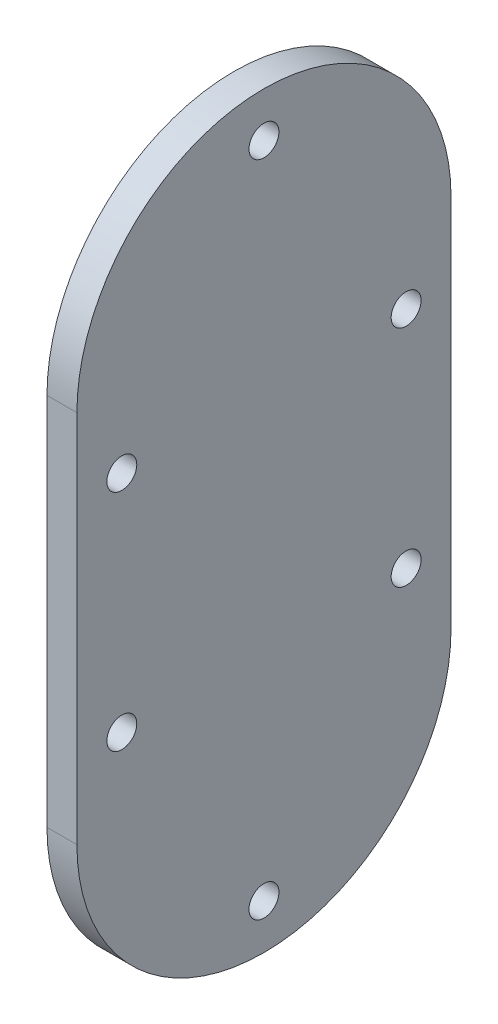
ISO-10303-21;
HEADER;
FILE_DESCRIPTION(('STEP AP214'),'2;1');
FILE_NAME('part.step','',(''),(''),'','','');
FILE_SCHEMA(('AUTOMOTIVE_DESIGN { 1 0 10303 214 1 1 1 1 }'));
ENDSEC;
DATA;
#1=APPLICATION_CONTEXT('core data for automotive mechanical design processes');
#2=APPLICATION_PROTOCOL_DEFINITION('international standard','automotive_design',2000,#1);
#3=PRODUCT_CONTEXT('',#1,'mechanical');
#4=PRODUCT('Part','Part','',(#3));
#5=PRODUCT_RELATED_PRODUCT_CATEGORY('part','',(#4));
#6=PRODUCT_DEFINITION_FORMATION('','',#4);
#7=PRODUCT_DEFINITION_CONTEXT('part definition',#1,'design');
#8=PRODUCT_DEFINITION('design','',#6,#7);
#9=PRODUCT_DEFINITION_SHAPE('','',#8);
#10=(LENGTH_UNIT() NAMED_UNIT(*) SI_UNIT(.MILLI.,.METRE.));
#11=(NAMED_UNIT(*) PLANE_ANGLE_UNIT() SI_UNIT($,.RADIAN.));
#12=(NAMED_UNIT(*) SI_UNIT($,.STERADIAN.) SOLID_ANGLE_UNIT());
#13=UNCERTAINTY_MEASURE_WITH_UNIT(LENGTH_MEASURE(1.E-05),#10,'distance_accuracy_value','');
#14=(GEOMETRIC_REPRESENTATION_CONTEXT(3) GLOBAL_UNCERTAINTY_ASSIGNED_CONTEXT((#13)) GLOBAL_UNIT_ASSIGNED_CONTEXT((#10,
#11,#12)) REPRESENTATION_CONTEXT('',''));
#15=CARTESIAN_POINT('',(0.,0.,0.));
#16=DIRECTION('',(0.,0.,1.));
#17=DIRECTION('',(1.,0.,0.));
#18=AXIS2_PLACEMENT_3D('',#15,#16,#17);
#19=CARTESIAN_POINT('',(4.,0.,0.));
#20=DIRECTION('',(1.,0.,0.));
#21=DIRECTION('',(0.,0.,-1.));
#22=AXIS2_PLACEMENT_3D('',#19,#20,#21);
#23=PLANE('',#22);
#24=CARTESIAN_POINT('',(4.,10.,-19.));
#25=DIRECTION('',(1.,0.,0.));
#26=DIRECTION('',(0.,0.,-1.));
#27=AXIS2_PLACEMENT_3D('',#24,#25,#26);
#28=CIRCLE('',#27,2.);
#29=CARTESIAN_POINT('',(4.,10.,-21.));
#30=VERTEX_POINT('',#29);
#31=EDGE_CURVE('E141',#30,#30,#28,.T.);
#32=ORIENTED_EDGE('',*,*,#31,.F.);
#33=EDGE_LOOP('',(#32));
#34=FACE_BOUND('',#33,.T.);
#35=CARTESIAN_POINT('',(4.,69.,0.));
#36=DIRECTION('',(1.,0.,0.));
#37=DIRECTION('',(0.,0.,-1.));
#38=AXIS2_PLACEMENT_3D('',#35,#36,#37);
#39=CIRCLE('',#38,2.);
#40=CARTESIAN_POINT('',(4.,69.,-2.));
#41=VERTEX_POINT('',#40);
#42=EDGE_CURVE('E129',#41,#41,#39,.T.);
#43=ORIENTED_EDGE('',*,*,#42,.F.);
#44=EDGE_LOOP('',(#43));
#45=FACE_BOUND('',#44,.T.);
#46=CARTESIAN_POINT('',(4.,10.,19.));
#47=DIRECTION('',(1.,0.,0.));
#48=DIRECTION('',(0.,0.,-1.));
#49=AXIS2_PLACEMENT_3D('',#46,#47,#48);
#50=CIRCLE('',#49,2.);
#51=CARTESIAN_POINT('',(4.,10.,17.));
#52=VERTEX_POINT('',#51);
#53=EDGE_CURVE('E108',#52,#52,#50,.T.);
#54=ORIENTED_EDGE('',*,*,#53,.F.);
#55=EDGE_LOOP('',(#54));
#56=FACE_BOUND('',#55,.T.);
#57=CARTESIAN_POINT('',(4.,0.,0.));
#58=DIRECTION('',(1.,0.,0.));
#59=DIRECTION('',(0.,0.,-1.));
#60=AXIS2_PLACEMENT_3D('',#57,#58,#59);
#61=CIRCLE('',#60,25.);
#62=CARTESIAN_POINT('',(4.,0.,25.));
#63=VERTEX_POINT('',#62);
#64=CARTESIAN_POINT('',(4.,0.,-25.));
#65=VERTEX_POINT('',#64);
#66=EDGE_CURVE('E93',#63,#65,#61,.T.);
#67=ORIENTED_EDGE('',*,*,#66,.T.);
#68=DIRECTION('',(0.,1.,0.));
#69=VECTOR('',#68,1.);
#70=CARTESIAN_POINT('',(4.,0.,-25.));
#71=LINE('',#70,#69);
#72=CARTESIAN_POINT('',(4.,50.,-25.));
#73=VERTEX_POINT('',#72);
#74=EDGE_CURVE('E88',#65,#73,#71,.T.);
#75=ORIENTED_EDGE('',*,*,#74,.T.);
#76=CARTESIAN_POINT('',(4.,50.,0.));
#77=DIRECTION('',(1.,0.,0.));
#78=DIRECTION('',(0.,0.,-1.));
#79=AXIS2_PLACEMENT_3D('',#76,#77,#78);
#80=CIRCLE('',#79,25.);
#81=CARTESIAN_POINT('',(4.,50.,25.));
#82=VERTEX_POINT('',#81);
#83=EDGE_CURVE('E91',#73,#82,#80,.T.);
#84=ORIENTED_EDGE('',*,*,#83,.T.);
#85=DIRECTION('',(0.,-1.,0.));
#86=VECTOR('',#85,1.);
#87=CARTESIAN_POINT('',(4.,0.,25.));
#88=LINE('',#87,#86);
#89=EDGE_CURVE('E58',#82,#63,#88,.T.);
#90=ORIENTED_EDGE('',*,*,#89,.T.);
#91=EDGE_LOOP('',(#67,#75,#84,#90));
#92=FACE_BOUND('',#91,.T.);
#93=CARTESIAN_POINT('',(4.,40.,19.));
#94=DIRECTION('',(1.,0.,0.));
#95=DIRECTION('',(0.,0.,-1.));
#96=AXIS2_PLACEMENT_3D('',#93,#94,#95);
#97=CIRCLE('',#96,2.);
#98=CARTESIAN_POINT('',(4.,40.,17.));
#99=VERTEX_POINT('',#98);
#100=EDGE_CURVE('E123',#99,#99,#97,.T.);
#101=ORIENTED_EDGE('',*,*,#100,.F.);
#102=EDGE_LOOP('',(#101));
#103=FACE_BOUND('',#102,.T.);
#104=CARTESIAN_POINT('',(4.,-19.,0.));
#105=DIRECTION('',(1.,0.,0.));
#106=DIRECTION('',(0.,0.,-1.));
#107=AXIS2_PLACEMENT_3D('',#104,#105,#106);
#108=CIRCLE('',#107,2.);
#109=CARTESIAN_POINT('',(4.,-19.,-2.));
#110=VERTEX_POINT('',#109);
#111=EDGE_CURVE('E135',#110,#110,#108,.T.);
#112=ORIENTED_EDGE('',*,*,#111,.F.);
#113=EDGE_LOOP('',(#112));
#114=FACE_BOUND('',#113,.T.);
#115=CARTESIAN_POINT('',(4.,40.,-19.));
#116=DIRECTION('',(1.,0.,0.));
#117=DIRECTION('',(0.,0.,-1.));
#118=AXIS2_PLACEMENT_3D('',#115,#116,#117);
#119=CIRCLE('',#118,2.);
#120=CARTESIAN_POINT('',(4.,40.,-21.));
#121=VERTEX_POINT('',#120);
#122=EDGE_CURVE('E147',#121,#121,#119,.T.);
#123=ORIENTED_EDGE('',*,*,#122,.F.);
#124=EDGE_LOOP('',(#123));
#125=FACE_BOUND('',#124,.T.);
#126=ADVANCED_FACE('F41',(#34,#45,#56,#92,#103,#114,#125),#23,.T.);
#127=CARTESIAN_POINT('',(0.,0.,0.));
#128=DIRECTION('',(1.,0.,0.));
#129=DIRECTION('',(0.,0.,-1.));
#130=AXIS2_PLACEMENT_3D('',#127,#128,#129);
#131=PLANE('',#130);
#132=CARTESIAN_POINT('',(0.,0.,0.));
#133=DIRECTION('',(1.,0.,0.));
#134=DIRECTION('',(0.,0.,-1.));
#135=AXIS2_PLACEMENT_3D('',#132,#133,#134);
#136=CIRCLE('',#135,25.);
#137=CARTESIAN_POINT('',(0.,0.,25.));
#138=VERTEX_POINT('',#137);
#139=CARTESIAN_POINT('',(0.,0.,-25.));
#140=VERTEX_POINT('',#139);
#141=EDGE_CURVE('E105',#138,#140,#136,.T.);
#142=ORIENTED_EDGE('',*,*,#141,.F.);
#143=DIRECTION('',(0.,-1.,0.));
#144=VECTOR('',#143,1.);
#145=CARTESIAN_POINT('',(0.,0.,25.));
#146=LINE('',#145,#144);
#147=CARTESIAN_POINT('',(0.,50.,25.));
#148=VERTEX_POINT('',#147);
#149=EDGE_CURVE('E81',#148,#138,#146,.T.);
#150=ORIENTED_EDGE('',*,*,#149,.F.);
#151=CARTESIAN_POINT('',(0.,50.,0.));
#152=DIRECTION('',(1.,0.,0.));
#153=DIRECTION('',(0.,0.,-1.));
#154=AXIS2_PLACEMENT_3D('',#151,#152,#153);
#155=CIRCLE('',#154,25.);
#156=CARTESIAN_POINT('',(0.,50.,-25.));
#157=VERTEX_POINT('',#156);
#158=EDGE_CURVE('E75',#157,#148,#155,.T.);
#159=ORIENTED_EDGE('',*,*,#158,.F.);
#160=DIRECTION('',(0.,1.,0.));
#161=VECTOR('',#160,1.);
#162=CARTESIAN_POINT('',(0.,0.,-25.));
#163=LINE('',#162,#161);
#164=EDGE_CURVE('E97',#140,#157,#163,.T.);
#165=ORIENTED_EDGE('',*,*,#164,.F.);
#166=EDGE_LOOP('',(#142,#150,#159,#165));
#167=FACE_BOUND('',#166,.T.);
#168=CARTESIAN_POINT('',(0.,10.,19.));
#169=DIRECTION('',(1.,0.,0.));
#170=DIRECTION('',(0.,0.,-1.));
#171=AXIS2_PLACEMENT_3D('',#168,#169,#170);
#172=CIRCLE('',#171,2.);
#173=CARTESIAN_POINT('',(0.,10.,17.));
#174=VERTEX_POINT('',#173);
#175=EDGE_CURVE('E120',#174,#174,#172,.T.);
#176=ORIENTED_EDGE('',*,*,#175,.T.);
#177=EDGE_LOOP('',(#176));
#178=FACE_BOUND('',#177,.T.);
#179=CARTESIAN_POINT('',(0.,40.,19.));
#180=DIRECTION('',(1.,0.,0.));
#181=DIRECTION('',(0.,0.,-1.));
#182=AXIS2_PLACEMENT_3D('',#179,#180,#181);
#183=CIRCLE('',#182,2.);
#184=CARTESIAN_POINT('',(0.,40.,17.));
#185=VERTEX_POINT('',#184);
#186=EDGE_CURVE('E126',#185,#185,#183,.T.);
#187=ORIENTED_EDGE('',*,*,#186,.T.);
#188=EDGE_LOOP('',(#187));
#189=FACE_BOUND('',#188,.T.);
#190=CARTESIAN_POINT('',(0.,69.,0.));
#191=DIRECTION('',(1.,0.,0.));
#192=DIRECTION('',(0.,0.,-1.));
#193=AXIS2_PLACEMENT_3D('',#190,#191,#192);
#194=CIRCLE('',#193,2.);
#195=CARTESIAN_POINT('',(0.,69.,-2.));
#196=VERTEX_POINT('',#195);
#197=EDGE_CURVE('E132',#196,#196,#194,.T.);
#198=ORIENTED_EDGE('',*,*,#197,.T.);
#199=EDGE_LOOP('',(#198));
#200=FACE_BOUND('',#199,.T.);
#201=CARTESIAN_POINT('',(0.,-19.,0.));
#202=DIRECTION('',(1.,0.,0.));
#203=DIRECTION('',(0.,0.,-1.));
#204=AXIS2_PLACEMENT_3D('',#201,#202,#203);
#205=CIRCLE('',#204,2.);
#206=CARTESIAN_POINT('',(0.,-19.,-2.));
#207=VERTEX_POINT('',#206);
#208=EDGE_CURVE('E138',#207,#207,#205,.T.);
#209=ORIENTED_EDGE('',*,*,#208,.T.);
#210=EDGE_LOOP('',(#209));
#211=FACE_BOUND('',#210,.T.);
#212=CARTESIAN_POINT('',(0.,10.,-19.));
#213=DIRECTION('',(1.,0.,0.));
#214=DIRECTION('',(0.,0.,-1.));
#215=AXIS2_PLACEMENT_3D('',#212,#213,#214);
#216=CIRCLE('',#215,2.);
#217=CARTESIAN_POINT('',(0.,10.,-21.));
#218=VERTEX_POINT('',#217);
#219=EDGE_CURVE('E144',#218,#218,#216,.T.);
#220=ORIENTED_EDGE('',*,*,#219,.T.);
#221=EDGE_LOOP('',(#220));
#222=FACE_BOUND('',#221,.T.);
#223=CARTESIAN_POINT('',(0.,40.,-19.));
#224=DIRECTION('',(1.,0.,0.));
#225=DIRECTION('',(0.,0.,-1.));
#226=AXIS2_PLACEMENT_3D('',#223,#224,#225);
#227=CIRCLE('',#226,2.);
#228=CARTESIAN_POINT('',(0.,40.,-21.));
#229=VERTEX_POINT('',#228);
#230=EDGE_CURVE('E150',#229,#229,#227,.T.);
#231=ORIENTED_EDGE('',*,*,#230,.T.);
#232=EDGE_LOOP('',(#231));
#233=FACE_BOUND('',#232,.T.);
#234=ADVANCED_FACE('F116',(#167,#178,#189,#200,#211,#222,#233),#131,.F.);
#235=CARTESIAN_POINT('',(4.,0.,0.));
#236=DIRECTION('',(-1.,0.,0.));
#237=DIRECTION('',(0.,0.,1.));
#238=AXIS2_PLACEMENT_3D('',#235,#236,#237);
#239=CYLINDRICAL_SURFACE('',#238,25.);
#240=ORIENTED_EDGE('',*,*,#141,.T.);
#241=DIRECTION('',(-1.,0.,0.));
#242=VECTOR('',#241,1.);
#243=CARTESIAN_POINT('',(4.,0.,-25.));
#244=LINE('',#243,#242);
#245=EDGE_CURVE('E11',#65,#140,#244,.T.);
#246=ORIENTED_EDGE('',*,*,#245,.F.);
#247=ORIENTED_EDGE('',*,*,#66,.F.);
#248=DIRECTION('',(-1.,0.,0.));
#249=VECTOR('',#248,1.);
#250=CARTESIAN_POINT('',(4.,0.,25.));
#251=LINE('',#250,#249);
#252=EDGE_CURVE('E101',#63,#138,#251,.T.);
#253=ORIENTED_EDGE('',*,*,#252,.T.);
#254=EDGE_LOOP('',(#240,#246,#247,#253));
#255=FACE_BOUND('',#254,.T.);
#256=ADVANCED_FACE('F43',(#255),#239,.T.);
#257=CARTESIAN_POINT('',(4.,0.,-25.));
#258=DIRECTION('',(0.,0.,1.));
#259=DIRECTION('',(1.,0.,0.));
#260=AXIS2_PLACEMENT_3D('',#257,#258,#259);
#261=PLANE('',#260);
#262=ORIENTED_EDGE('',*,*,#164,.T.);
#263=DIRECTION('',(-1.,0.,0.));
#264=VECTOR('',#263,1.);
#265=CARTESIAN_POINT('',(4.,50.,-25.));
#266=LINE('',#265,#264);
#267=EDGE_CURVE('E50',#73,#157,#266,.T.);
#268=ORIENTED_EDGE('',*,*,#267,.F.);
#269=ORIENTED_EDGE('',*,*,#74,.F.);
#270=ORIENTED_EDGE('',*,*,#245,.T.);
#271=EDGE_LOOP('',(#262,#268,#269,#270));
#272=FACE_BOUND('',#271,.T.);
#273=ADVANCED_FACE('F96',(#272),#261,.F.);
#274=CARTESIAN_POINT('',(4.,50.,0.));
#275=DIRECTION('',(-1.,0.,0.));
#276=DIRECTION('',(0.,0.,1.));
#277=AXIS2_PLACEMENT_3D('',#274,#275,#276);
#278=CYLINDRICAL_SURFACE('',#277,25.);
#279=ORIENTED_EDGE('',*,*,#158,.T.);
#280=DIRECTION('',(-1.,0.,0.));
#281=VECTOR('',#280,1.);
#282=CARTESIAN_POINT('',(4.,50.,25.));
#283=LINE('',#282,#281);
#284=EDGE_CURVE('E98',#82,#148,#283,.T.);
#285=ORIENTED_EDGE('',*,*,#284,.F.);
#286=ORIENTED_EDGE('',*,*,#83,.F.);
#287=ORIENTED_EDGE('',*,*,#267,.T.);
#288=EDGE_LOOP('',(#279,#285,#286,#287));
#289=FACE_BOUND('',#288,.T.);
#290=ADVANCED_FACE('F99',(#289),#278,.T.);
#291=CARTESIAN_POINT('',(4.,0.,25.));
#292=DIRECTION('',(0.,0.,-1.));
#293=DIRECTION('',(-1.,0.,0.));
#294=AXIS2_PLACEMENT_3D('',#291,#292,#293);
#295=PLANE('',#294);
#296=ORIENTED_EDGE('',*,*,#149,.T.);
#297=ORIENTED_EDGE('',*,*,#252,.F.);
#298=ORIENTED_EDGE('',*,*,#89,.F.);
#299=ORIENTED_EDGE('',*,*,#284,.T.);
#300=EDGE_LOOP('',(#296,#297,#298,#299));
#301=FACE_BOUND('',#300,.T.);
#302=ADVANCED_FACE('F113',(#301),#295,.F.);
#303=CARTESIAN_POINT('',(4.,10.,19.));
#304=DIRECTION('',(-1.,0.,0.));
#305=DIRECTION('',(0.,0.,1.));
#306=AXIS2_PLACEMENT_3D('',#303,#304,#305);
#307=CYLINDRICAL_SURFACE('',#306,2.);
#308=ORIENTED_EDGE('',*,*,#53,.T.);
#309=EDGE_LOOP('',(#308));
#310=FACE_BOUND('',#309,.T.);
#311=ORIENTED_EDGE('',*,*,#175,.F.);
#312=EDGE_LOOP('',(#311));
#313=FACE_BOUND('',#312,.T.);
#314=ADVANCED_FACE('F169',(#310,#313),#307,.F.);
#315=CARTESIAN_POINT('',(4.,40.,19.));
#316=DIRECTION('',(-1.,0.,0.));
#317=DIRECTION('',(0.,0.,1.));
#318=AXIS2_PLACEMENT_3D('',#315,#316,#317);
#319=CYLINDRICAL_SURFACE('',#318,2.);
#320=ORIENTED_EDGE('',*,*,#100,.T.);
#321=EDGE_LOOP('',(#320));
#322=FACE_BOUND('',#321,.T.);
#323=ORIENTED_EDGE('',*,*,#186,.F.);
#324=EDGE_LOOP('',(#323));
#325=FACE_BOUND('',#324,.T.);
#326=ADVANCED_FACE('F214',(#322,#325),#319,.F.);
#327=CARTESIAN_POINT('',(4.,69.,0.));
#328=DIRECTION('',(-1.,0.,0.));
#329=DIRECTION('',(0.,0.,1.));
#330=AXIS2_PLACEMENT_3D('',#327,#328,#329);
#331=CYLINDRICAL_SURFACE('',#330,2.);
#332=ORIENTED_EDGE('',*,*,#42,.T.);
#333=EDGE_LOOP('',(#332));
#334=FACE_BOUND('',#333,.T.);
#335=ORIENTED_EDGE('',*,*,#197,.F.);
#336=EDGE_LOOP('',(#335));
#337=FACE_BOUND('',#336,.T.);
#338=ADVANCED_FACE('F222',(#334,#337),#331,.F.);
#339=CARTESIAN_POINT('',(4.,-19.,0.));
#340=DIRECTION('',(-1.,0.,0.));
#341=DIRECTION('',(0.,0.,1.));
#342=AXIS2_PLACEMENT_3D('',#339,#340,#341);
#343=CYLINDRICAL_SURFACE('',#342,2.);
#344=ORIENTED_EDGE('',*,*,#111,.T.);
#345=EDGE_LOOP('',(#344));
#346=FACE_BOUND('',#345,.T.);
#347=ORIENTED_EDGE('',*,*,#208,.F.);
#348=EDGE_LOOP('',(#347));
#349=FACE_BOUND('',#348,.T.);
#350=ADVANCED_FACE('F230',(#346,#349),#343,.F.);
#351=CARTESIAN_POINT('',(4.,10.,-19.));
#352=DIRECTION('',(-1.,0.,0.));
#353=DIRECTION('',(0.,0.,1.));
#354=AXIS2_PLACEMENT_3D('',#351,#352,#353);
#355=CYLINDRICAL_SURFACE('',#354,2.);
#356=ORIENTED_EDGE('',*,*,#31,.T.);
#357=EDGE_LOOP('',(#356));
#358=FACE_BOUND('',#357,.T.);
#359=ORIENTED_EDGE('',*,*,#219,.F.);
#360=EDGE_LOOP('',(#359));
#361=FACE_BOUND('',#360,.T.);
#362=ADVANCED_FACE('F239',(#358,#361),#355,.F.);
#363=CARTESIAN_POINT('',(4.,40.,-19.));
#364=DIRECTION('',(-1.,0.,0.));
#365=DIRECTION('',(0.,0.,1.));
#366=AXIS2_PLACEMENT_3D('',#363,#364,#365);
#367=CYLINDRICAL_SURFACE('',#366,2.);
#368=ORIENTED_EDGE('',*,*,#122,.T.);
#369=EDGE_LOOP('',(#368));
#370=FACE_BOUND('',#369,.T.);
#371=ORIENTED_EDGE('',*,*,#230,.F.);
#372=EDGE_LOOP('',(#371));
#373=FACE_BOUND('',#372,.T.);
#374=ADVANCED_FACE('F156',(#370,#373),#367,.F.);
#375=CLOSED_SHELL('',(#126,#234,#256,#273,#290,#302,#314,#326,#338,#350,#362,#374));
#376=MANIFOLD_SOLID_BREP('B2',#375);
#377=ADVANCED_BREP_SHAPE_REPRESENTATION('',(#18,#376),#14);
#378=SHAPE_DEFINITION_REPRESENTATION(#9,#377);
ENDSEC;
END-ISO-10303-21;
